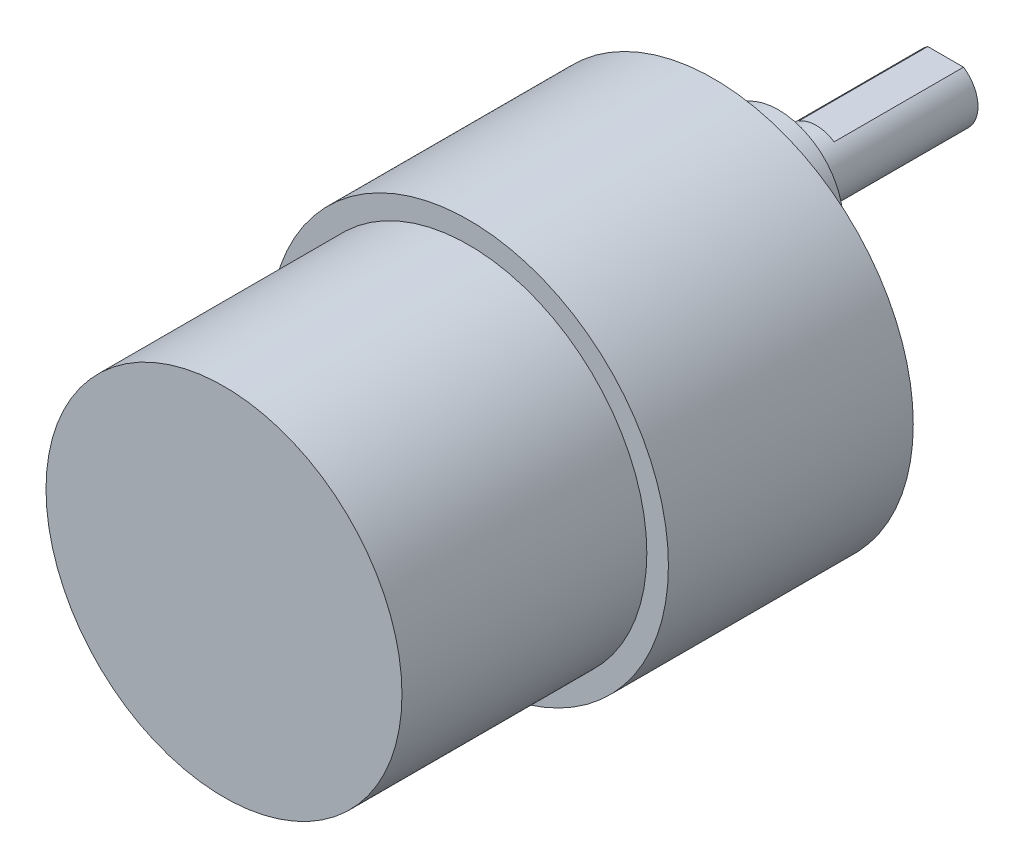
ISO-10303-21;
HEADER;
FILE_DESCRIPTION(('STEP AP214'),'2;1');
FILE_NAME('part.step','',(''),(''),'','','');
FILE_SCHEMA(('AUTOMOTIVE_DESIGN { 1 0 10303 214 1 1 1 1 }'));
ENDSEC;
DATA;
#1=APPLICATION_CONTEXT('core data for automotive mechanical design processes');
#2=APPLICATION_PROTOCOL_DEFINITION('international standard','automotive_design',2000,#1);
#3=PRODUCT_CONTEXT('',#1,'mechanical');
#4=PRODUCT('Part','Part','',(#3));
#5=PRODUCT_RELATED_PRODUCT_CATEGORY('part','',(#4));
#6=PRODUCT_DEFINITION_FORMATION('','',#4);
#7=PRODUCT_DEFINITION_CONTEXT('part definition',#1,'design');
#8=PRODUCT_DEFINITION('design','',#6,#7);
#9=PRODUCT_DEFINITION_SHAPE('','',#8);
#10=(LENGTH_UNIT() NAMED_UNIT(*) SI_UNIT(.MILLI.,.METRE.));
#11=(NAMED_UNIT(*) PLANE_ANGLE_UNIT() SI_UNIT($,.RADIAN.));
#12=(NAMED_UNIT(*) SI_UNIT($,.STERADIAN.) SOLID_ANGLE_UNIT());
#13=UNCERTAINTY_MEASURE_WITH_UNIT(LENGTH_MEASURE(1.E-05),#10,'distance_accuracy_value','');
#14=(GEOMETRIC_REPRESENTATION_CONTEXT(3) GLOBAL_UNCERTAINTY_ASSIGNED_CONTEXT((#13)) GLOBAL_UNIT_ASSIGNED_CONTEXT((#10,
#11,#12)) REPRESENTATION_CONTEXT('',''));
#15=CARTESIAN_POINT('',(0.,0.,0.));
#16=DIRECTION('',(0.,0.,1.));
#17=DIRECTION('',(1.,0.,0.));
#18=AXIS2_PLACEMENT_3D('',#15,#16,#17);
#19=CARTESIAN_POINT('',(0.,0.,22.7));
#20=DIRECTION('',(0.,0.,-1.));
#21=DIRECTION('',(-1.,0.,0.));
#22=AXIS2_PLACEMENT_3D('',#19,#20,#21);
#23=CYLINDRICAL_SURFACE('',#22,18.5);
#24=CARTESIAN_POINT('',(0.,0.,22.7));
#25=DIRECTION('',(0.,0.,1.));
#26=DIRECTION('',(1.,0.,0.));
#27=AXIS2_PLACEMENT_3D('',#24,#25,#26);
#28=CIRCLE('',#27,18.5);
#29=CARTESIAN_POINT('',(18.5,0.,22.7));
#30=VERTEX_POINT('',#29);
#31=EDGE_CURVE('E93',#30,#30,#28,.T.);
#32=ORIENTED_EDGE('',*,*,#31,.F.);
#33=EDGE_LOOP('',(#32));
#34=FACE_BOUND('',#33,.T.);
#35=CARTESIAN_POINT('',(0.,0.,0.));
#36=DIRECTION('',(0.,0.,1.));
#37=DIRECTION('',(1.,0.,0.));
#38=AXIS2_PLACEMENT_3D('',#35,#36,#37);
#39=CIRCLE('',#38,18.5);
#40=CARTESIAN_POINT('',(18.5,0.,0.));
#41=VERTEX_POINT('',#40);
#42=EDGE_CURVE('E89',#41,#41,#39,.T.);
#43=ORIENTED_EDGE('',*,*,#42,.T.);
#44=EDGE_LOOP('',(#43));
#45=FACE_BOUND('',#44,.T.);
#46=ADVANCED_FACE('F40',(#34,#45),#23,.T.);
#47=CARTESIAN_POINT('',(0.,0.,22.7));
#48=DIRECTION('',(0.,0.,1.));
#49=DIRECTION('',(1.,0.,0.));
#50=AXIS2_PLACEMENT_3D('',#47,#48,#49);
#51=PLANE('',#50);
#52=CARTESIAN_POINT('',(0.,0.,22.7));
#53=DIRECTION('',(0.,0.,1.));
#54=DIRECTION('',(1.,0.,0.));
#55=AXIS2_PLACEMENT_3D('',#52,#53,#54);
#56=CIRCLE('',#55,16.5);
#57=CARTESIAN_POINT('',(16.5,0.,22.7));
#58=VERTEX_POINT('',#57);
#59=EDGE_CURVE('E90',#58,#58,#56,.T.);
#60=ORIENTED_EDGE('',*,*,#59,.F.);
#61=EDGE_LOOP('',(#60));
#62=FACE_BOUND('',#61,.T.);
#63=ORIENTED_EDGE('',*,*,#31,.T.);
#64=EDGE_LOOP('',(#63));
#65=FACE_BOUND('',#64,.T.);
#66=ADVANCED_FACE('F107',(#62,#65),#51,.T.);
#67=CARTESIAN_POINT('',(0.,0.,0.));
#68=DIRECTION('',(0.,0.,1.));
#69=DIRECTION('',(1.,0.,0.));
#70=AXIS2_PLACEMENT_3D('',#67,#68,#69);
#71=PLANE('',#70);
#72=CARTESIAN_POINT('',(0.,15.5,0.));
#73=DIRECTION('',(0.,0.,-1.));
#74=DIRECTION('',(-1.,0.,0.));
#75=AXIS2_PLACEMENT_3D('',#72,#73,#74);
#76=CIRCLE('',#75,1.6);
#77=CARTESIAN_POINT('',(-1.6,15.5,0.));
#78=VERTEX_POINT('',#77);
#79=EDGE_CURVE('E200',#78,#78,#76,.T.);
#80=ORIENTED_EDGE('',*,*,#79,.F.);
#81=EDGE_LOOP('',(#80));
#82=FACE_BOUND('',#81,.T.);
#83=CARTESIAN_POINT('',(13.4233937586586,7.74999999999961,0.));
#84=DIRECTION('',(0.,0.,-1.));
#85=DIRECTION('',(-1.,0.,0.));
#86=AXIS2_PLACEMENT_3D('',#83,#84,#85);
#87=CIRCLE('',#86,1.60000000000051);
#88=CARTESIAN_POINT('',(11.8233937586581,7.74999999999961,0.));
#89=VERTEX_POINT('',#88);
#90=EDGE_CURVE('E211',#89,#89,#87,.T.);
#91=ORIENTED_EDGE('',*,*,#90,.F.);
#92=EDGE_LOOP('',(#91));
#93=FACE_BOUND('',#92,.T.);
#94=CARTESIAN_POINT('',(13.4233937586581,-7.75000000000039,0.));
#95=DIRECTION('',(0.,0.,-1.));
#96=DIRECTION('',(-1.,0.,0.));
#97=AXIS2_PLACEMENT_3D('',#94,#95,#96);
#98=CIRCLE('',#97,1.60000000000088);
#99=CARTESIAN_POINT('',(11.8233937586573,-7.75000000000039,0.));
#100=VERTEX_POINT('',#99);
#101=EDGE_CURVE('E210',#100,#100,#98,.T.);
#102=ORIENTED_EDGE('',*,*,#101,.F.);
#103=EDGE_LOOP('',(#102));
#104=FACE_BOUND('',#103,.T.);
#105=CARTESIAN_POINT('',(-8.77276587265167E-13,-15.5,0.));
#106=DIRECTION('',(0.,0.,-1.));
#107=DIRECTION('',(-1.,0.,0.));
#108=AXIS2_PLACEMENT_3D('',#105,#106,#107);
#109=CIRCLE('',#108,1.60000000000094);
#110=CARTESIAN_POINT('',(-1.60000000000182,-15.5,0.));
#111=VERTEX_POINT('',#110);
#112=EDGE_CURVE('E228',#111,#111,#109,.T.);
#113=ORIENTED_EDGE('',*,*,#112,.F.);
#114=EDGE_LOOP('',(#113));
#115=FACE_BOUND('',#114,.T.);
#116=CARTESIAN_POINT('',(-13.4233937586595,-7.74999999999962,0.));
#117=DIRECTION('',(0.,0.,-1.));
#118=DIRECTION('',(-1.,0.,0.));
#119=AXIS2_PLACEMENT_3D('',#116,#117,#118);
#120=CIRCLE('',#119,1.60000000000059);
#121=CARTESIAN_POINT('',(-15.02339375866,-7.74999999999962,0.));
#122=VERTEX_POINT('',#121);
#123=EDGE_CURVE('E222',#122,#122,#120,.T.);
#124=ORIENTED_EDGE('',*,*,#123,.F.);
#125=EDGE_LOOP('',(#124));
#126=FACE_BOUND('',#125,.T.);
#127=CARTESIAN_POINT('',(-13.423393758659,7.75000000000038,0.));
#128=DIRECTION('',(0.,0.,-1.));
#129=DIRECTION('',(-1.,0.,0.));
#130=AXIS2_PLACEMENT_3D('',#127,#128,#129);
#131=CIRCLE('',#130,1.60000000000014);
#132=CARTESIAN_POINT('',(-15.0233937586592,7.75000000000038,0.));
#133=VERTEX_POINT('',#132);
#134=EDGE_CURVE('E216',#133,#133,#131,.T.);
#135=ORIENTED_EDGE('',*,*,#134,.F.);
#136=EDGE_LOOP('',(#135));
#137=FACE_BOUND('',#136,.T.);
#138=CARTESIAN_POINT('',(0.,7.,0.));
#139=DIRECTION('',(0.,0.,1.));
#140=DIRECTION('',(1.,0.,0.));
#141=AXIS2_PLACEMENT_3D('',#138,#139,#140);
#142=CIRCLE('',#141,6.);
#143=CARTESIAN_POINT('',(6.,7.,0.));
#144=VERTEX_POINT('',#143);
#145=EDGE_CURVE('E85',#144,#144,#142,.F.);
#146=ORIENTED_EDGE('',*,*,#145,.F.);
#147=EDGE_LOOP('',(#146));
#148=FACE_BOUND('',#147,.T.);
#149=ORIENTED_EDGE('',*,*,#42,.F.);
#150=EDGE_LOOP('',(#149));
#151=FACE_BOUND('',#150,.T.);
#152=ADVANCED_FACE('F103',(#82,#93,#104,#115,#126,#137,#148,#151),#71,.F.);
#153=CARTESIAN_POINT('',(0.,0.,45.4));
#154=DIRECTION('',(0.,0.,-1.));
#155=DIRECTION('',(-1.,0.,0.));
#156=AXIS2_PLACEMENT_3D('',#153,#154,#155);
#157=CYLINDRICAL_SURFACE('',#156,16.5);
#158=CARTESIAN_POINT('',(0.,0.,45.4));
#159=DIRECTION('',(0.,0.,1.));
#160=DIRECTION('',(1.,0.,0.));
#161=AXIS2_PLACEMENT_3D('',#158,#159,#160);
#162=CIRCLE('',#161,16.5);
#163=CARTESIAN_POINT('',(16.5,0.,45.4));
#164=VERTEX_POINT('',#163);
#165=EDGE_CURVE('E80',#164,#164,#162,.T.);
#166=ORIENTED_EDGE('',*,*,#165,.F.);
#167=EDGE_LOOP('',(#166));
#168=FACE_BOUND('',#167,.T.);
#169=ORIENTED_EDGE('',*,*,#59,.T.);
#170=EDGE_LOOP('',(#169));
#171=FACE_BOUND('',#170,.T.);
#172=ADVANCED_FACE('F106',(#168,#171),#157,.T.);
#173=CARTESIAN_POINT('',(0.,0.,45.4));
#174=DIRECTION('',(0.,0.,1.));
#175=DIRECTION('',(1.,0.,0.));
#176=AXIS2_PLACEMENT_3D('',#173,#174,#175);
#177=PLANE('',#176);
#178=ORIENTED_EDGE('',*,*,#165,.T.);
#179=EDGE_LOOP('',(#178));
#180=FACE_BOUND('',#179,.T.);
#181=ADVANCED_FACE('F126',(#180),#177,.T.);
#182=CARTESIAN_POINT('',(0.,7.,-6.));
#183=DIRECTION('',(0.,0.,1.));
#184=DIRECTION('',(1.,0.,0.));
#185=AXIS2_PLACEMENT_3D('',#182,#183,#184);
#186=CYLINDRICAL_SURFACE('',#185,6.);
#187=CARTESIAN_POINT('',(0.,7.,-6.));
#188=DIRECTION('',(0.,0.,-1.));
#189=DIRECTION('',(-1.,0.,0.));
#190=AXIS2_PLACEMENT_3D('',#187,#188,#189);
#191=CIRCLE('',#190,6.);
#192=CARTESIAN_POINT('',(-6.,7.,-6.));
#193=VERTEX_POINT('',#192);
#194=EDGE_CURVE('E77',#193,#193,#191,.T.);
#195=ORIENTED_EDGE('',*,*,#194,.F.);
#196=EDGE_LOOP('',(#195));
#197=FACE_BOUND('',#196,.T.);
#198=ORIENTED_EDGE('',*,*,#145,.T.);
#199=EDGE_LOOP('',(#198));
#200=FACE_BOUND('',#199,.T.);
#201=ADVANCED_FACE('F101',(#197,#200),#186,.T.);
#202=CARTESIAN_POINT('',(0.,7.,-6.));
#203=DIRECTION('',(0.,0.,-1.));
#204=DIRECTION('',(-1.,0.,0.));
#205=AXIS2_PLACEMENT_3D('',#202,#203,#204);
#206=PLANE('',#205);
#207=CARTESIAN_POINT('',(0.,7.,-6.));
#208=DIRECTION('',(0.,0.,-1.));
#209=DIRECTION('',(-1.,0.,0.));
#210=AXIS2_PLACEMENT_3D('',#207,#208,#209);
#211=CIRCLE('',#210,3.);
#212=CARTESIAN_POINT('',(-3.,7.,-6.));
#213=VERTEX_POINT('',#212);
#214=EDGE_CURVE('E68',#213,#213,#211,.T.);
#215=ORIENTED_EDGE('',*,*,#214,.F.);
#216=EDGE_LOOP('',(#215));
#217=FACE_BOUND('',#216,.T.);
#218=ORIENTED_EDGE('',*,*,#194,.T.);
#219=EDGE_LOOP('',(#218));
#220=FACE_BOUND('',#219,.T.);
#221=ADVANCED_FACE('F133',(#217,#220),#206,.T.);
#222=CARTESIAN_POINT('',(0.,7.,-21.5));
#223=DIRECTION('',(0.,0.,1.));
#224=DIRECTION('',(1.,0.,0.));
#225=AXIS2_PLACEMENT_3D('',#222,#223,#224);
#226=CYLINDRICAL_SURFACE('',#225,3.);
#227=CARTESIAN_POINT('',(0.,7.,-21.5));
#228=DIRECTION('',(0.,0.,-1.));
#229=DIRECTION('',(-1.,0.,0.));
#230=AXIS2_PLACEMENT_3D('',#227,#228,#229);
#231=CIRCLE('',#230,3.);
#232=CARTESIAN_POINT('',(1.6583123951777,9.5,-21.5));
#233=VERTEX_POINT('',#232);
#234=CARTESIAN_POINT('',(-1.6583123951777,9.5,-21.5));
#235=VERTEX_POINT('',#234);
#236=EDGE_CURVE('E73',#233,#235,#231,.T.);
#237=ORIENTED_EDGE('',*,*,#236,.F.);
#238=DIRECTION('',(0.,0.,1.));
#239=VECTOR('',#238,1.);
#240=CARTESIAN_POINT('',(1.6583123951777,9.5,-21.5));
#241=LINE('',#240,#239);
#242=CARTESIAN_POINT('',(1.6583123951777,9.5,-9.5));
#243=VERTEX_POINT('',#242);
#244=EDGE_CURVE('E54',#233,#243,#241,.T.);
#245=ORIENTED_EDGE('',*,*,#244,.T.);
#246=CARTESIAN_POINT('',(0.,7.,-9.5));
#247=DIRECTION('',(0.,0.,-1.));
#248=DIRECTION('',(-1.,0.,0.));
#249=AXIS2_PLACEMENT_3D('',#246,#247,#248);
#250=CIRCLE('',#249,3.);
#251=CARTESIAN_POINT('',(-1.6583123951777,9.5,-9.5));
#252=VERTEX_POINT('',#251);
#253=EDGE_CURVE('E11',#252,#243,#250,.T.);
#254=ORIENTED_EDGE('',*,*,#253,.F.);
#255=DIRECTION('',(0.,0.,1.));
#256=VECTOR('',#255,1.);
#257=CARTESIAN_POINT('',(-1.6583123951777,9.5,-21.5));
#258=LINE('',#257,#256);
#259=EDGE_CURVE('E59',#252,#235,#258,.F.);
#260=ORIENTED_EDGE('',*,*,#259,.T.);
#261=EDGE_LOOP('',(#237,#245,#254,#260));
#262=FACE_BOUND('',#261,.T.);
#263=ORIENTED_EDGE('',*,*,#214,.T.);
#264=EDGE_LOOP('',(#263));
#265=FACE_BOUND('',#264,.T.);
#266=ADVANCED_FACE('F71',(#262,#265),#226,.T.);
#267=CARTESIAN_POINT('',(0.,7.,-21.5));
#268=DIRECTION('',(0.,0.,-1.));
#269=DIRECTION('',(-1.,0.,0.));
#270=AXIS2_PLACEMENT_3D('',#267,#268,#269);
#271=PLANE('',#270);
#272=DIRECTION('',(-1.,0.,0.));
#273=VECTOR('',#272,1.);
#274=CARTESIAN_POINT('',(0.,9.5,-21.5));
#275=LINE('',#274,#273);
#276=EDGE_CURVE('E47',#233,#235,#275,.T.);
#277=ORIENTED_EDGE('',*,*,#276,.F.);
#278=ORIENTED_EDGE('',*,*,#236,.T.);
#279=EDGE_LOOP('',(#277,#278));
#280=FACE_BOUND('',#279,.T.);
#281=ADVANCED_FACE('F76',(#280),#271,.T.);
#282=CARTESIAN_POINT('',(0.,0.,-9.5));
#283=DIRECTION('',(0.,0.,-1.));
#284=DIRECTION('',(-1.,0.,0.));
#285=AXIS2_PLACEMENT_3D('',#282,#283,#284);
#286=PLANE('',#285);
#287=ORIENTED_EDGE('',*,*,#253,.T.);
#288=DIRECTION('',(-1.,0.,0.));
#289=VECTOR('',#288,1.);
#290=CARTESIAN_POINT('',(6.23706785214188,9.5,-9.5));
#291=LINE('',#290,#289);
#292=EDGE_CURVE('E74',#243,#252,#291,.T.);
#293=ORIENTED_EDGE('',*,*,#292,.T.);
#294=EDGE_LOOP('',(#287,#293));
#295=FACE_BOUND('',#294,.T.);
#296=ADVANCED_FACE('F142',(#295),#286,.T.);
#297=CARTESIAN_POINT('',(6.23706785214188,9.5,-9.5));
#298=DIRECTION('',(0.,-1.,0.));
#299=DIRECTION('',(0.,0.,-1.));
#300=AXIS2_PLACEMENT_3D('',#297,#298,#299);
#301=PLANE('',#300);
#302=ORIENTED_EDGE('',*,*,#276,.T.);
#303=ORIENTED_EDGE('',*,*,#259,.F.);
#304=ORIENTED_EDGE('',*,*,#292,.F.);
#305=ORIENTED_EDGE('',*,*,#244,.F.);
#306=EDGE_LOOP('',(#302,#303,#304,#305));
#307=FACE_BOUND('',#306,.T.);
#308=ADVANCED_FACE('F64',(#307),#301,.F.);
#309=CARTESIAN_POINT('',(-13.423393758659,7.75000000000038,10.));
#310=DIRECTION('',(0.,0.,-1.));
#311=DIRECTION('',(-1.,0.,0.));
#312=AXIS2_PLACEMENT_3D('',#309,#310,#311);
#313=CYLINDRICAL_SURFACE('',#312,1.60000000000014);
#314=CARTESIAN_POINT('',(-13.423393758659,7.75000000000038,10.));
#315=DIRECTION('',(0.,0.,-1.));
#316=DIRECTION('',(-1.,0.,0.));
#317=AXIS2_PLACEMENT_3D('',#314,#315,#316);
#318=CIRCLE('',#317,1.60000000000014);
#319=CARTESIAN_POINT('',(-15.0233937586592,7.75000000000038,10.));
#320=VERTEX_POINT('',#319);
#321=EDGE_CURVE('E204',#320,#320,#318,.T.);
#322=ORIENTED_EDGE('',*,*,#321,.F.);
#323=EDGE_LOOP('',(#322));
#324=FACE_BOUND('',#323,.T.);
#325=ORIENTED_EDGE('',*,*,#134,.T.);
#326=EDGE_LOOP('',(#325));
#327=FACE_BOUND('',#326,.T.);
#328=ADVANCED_FACE('F145',(#324,#327),#313,.F.);
#329=CARTESIAN_POINT('',(-13.423393758659,7.75000000000038,10.));
#330=DIRECTION('',(0.,0.,-1.));
#331=DIRECTION('',(-1.,0.,0.));
#332=AXIS2_PLACEMENT_3D('',#329,#330,#331);
#333=PLANE('',#332);
#334=ORIENTED_EDGE('',*,*,#321,.T.);
#335=EDGE_LOOP('',(#334));
#336=FACE_BOUND('',#335,.T.);
#337=ADVANCED_FACE('F170',(#336),#333,.T.);
#338=CARTESIAN_POINT('',(-13.4233937586595,-7.74999999999962,10.));
#339=DIRECTION('',(0.,0.,-1.));
#340=DIRECTION('',(-1.,0.,0.));
#341=AXIS2_PLACEMENT_3D('',#338,#339,#340);
#342=CYLINDRICAL_SURFACE('',#341,1.60000000000059);
#343=CARTESIAN_POINT('',(-13.4233937586595,-7.74999999999962,10.));
#344=DIRECTION('',(0.,0.,-1.));
#345=DIRECTION('',(-1.,0.,0.));
#346=AXIS2_PLACEMENT_3D('',#343,#344,#345);
#347=CIRCLE('',#346,1.60000000000059);
#348=CARTESIAN_POINT('',(-15.02339375866,-7.74999999999962,10.));
#349=VERTEX_POINT('',#348);
#350=EDGE_CURVE('E219',#349,#349,#347,.T.);
#351=ORIENTED_EDGE('',*,*,#350,.F.);
#352=EDGE_LOOP('',(#351));
#353=FACE_BOUND('',#352,.T.);
#354=ORIENTED_EDGE('',*,*,#123,.T.);
#355=EDGE_LOOP('',(#354));
#356=FACE_BOUND('',#355,.T.);
#357=ADVANCED_FACE('F167',(#353,#356),#342,.F.);
#358=CARTESIAN_POINT('',(-13.4233937586595,-7.74999999999962,10.));
#359=DIRECTION('',(0.,0.,-1.));
#360=DIRECTION('',(-1.,0.,0.));
#361=AXIS2_PLACEMENT_3D('',#358,#359,#360);
#362=PLANE('',#361);
#363=ORIENTED_EDGE('',*,*,#350,.T.);
#364=EDGE_LOOP('',(#363));
#365=FACE_BOUND('',#364,.T.);
#366=ADVANCED_FACE('F162',(#365),#362,.T.);
#367=CARTESIAN_POINT('',(-8.77276587265167E-13,-15.5,10.));
#368=DIRECTION('',(0.,0.,-1.));
#369=DIRECTION('',(-1.,0.,0.));
#370=AXIS2_PLACEMENT_3D('',#367,#368,#369);
#371=CYLINDRICAL_SURFACE('',#370,1.60000000000094);
#372=CARTESIAN_POINT('',(-8.77276587265167E-13,-15.5,10.));
#373=DIRECTION('',(0.,0.,-1.));
#374=DIRECTION('',(-1.,0.,0.));
#375=AXIS2_PLACEMENT_3D('',#372,#373,#374);
#376=CIRCLE('',#375,1.60000000000094);
#377=CARTESIAN_POINT('',(-1.60000000000182,-15.5,10.));
#378=VERTEX_POINT('',#377);
#379=EDGE_CURVE('E225',#378,#378,#376,.T.);
#380=ORIENTED_EDGE('',*,*,#379,.F.);
#381=EDGE_LOOP('',(#380));
#382=FACE_BOUND('',#381,.T.);
#383=ORIENTED_EDGE('',*,*,#112,.T.);
#384=EDGE_LOOP('',(#383));
#385=FACE_BOUND('',#384,.T.);
#386=ADVANCED_FACE('F159',(#382,#385),#371,.F.);
#387=CARTESIAN_POINT('',(-8.77276587265167E-13,-15.5,10.));
#388=DIRECTION('',(0.,0.,-1.));
#389=DIRECTION('',(-1.,0.,0.));
#390=AXIS2_PLACEMENT_3D('',#387,#388,#389);
#391=PLANE('',#390);
#392=ORIENTED_EDGE('',*,*,#379,.T.);
#393=EDGE_LOOP('',(#392));
#394=FACE_BOUND('',#393,.T.);
#395=ADVANCED_FACE('F153',(#394),#391,.T.);
#396=CARTESIAN_POINT('',(13.4233937586581,-7.75000000000039,10.));
#397=DIRECTION('',(0.,0.,-1.));
#398=DIRECTION('',(-1.,0.,0.));
#399=AXIS2_PLACEMENT_3D('',#396,#397,#398);
#400=CYLINDRICAL_SURFACE('',#399,1.60000000000088);
#401=CARTESIAN_POINT('',(13.4233937586581,-7.75000000000039,10.));
#402=DIRECTION('',(0.,0.,-1.));
#403=DIRECTION('',(-1.,0.,0.));
#404=AXIS2_PLACEMENT_3D('',#401,#402,#403);
#405=CIRCLE('',#404,1.60000000000088);
#406=CARTESIAN_POINT('',(11.8233937586573,-7.75000000000039,10.));
#407=VERTEX_POINT('',#406);
#408=EDGE_CURVE('E231',#407,#407,#405,.T.);
#409=ORIENTED_EDGE('',*,*,#408,.F.);
#410=EDGE_LOOP('',(#409));
#411=FACE_BOUND('',#410,.T.);
#412=ORIENTED_EDGE('',*,*,#101,.T.);
#413=EDGE_LOOP('',(#412));
#414=FACE_BOUND('',#413,.T.);
#415=ADVANCED_FACE('F149',(#411,#414),#400,.F.);
#416=CARTESIAN_POINT('',(13.4233937586581,-7.75000000000039,10.));
#417=DIRECTION('',(0.,0.,-1.));
#418=DIRECTION('',(-1.,0.,0.));
#419=AXIS2_PLACEMENT_3D('',#416,#417,#418);
#420=PLANE('',#419);
#421=ORIENTED_EDGE('',*,*,#408,.T.);
#422=EDGE_LOOP('',(#421));
#423=FACE_BOUND('',#422,.T.);
#424=ADVANCED_FACE('F152',(#423),#420,.T.);
#425=CARTESIAN_POINT('',(13.4233937586586,7.74999999999961,10.));
#426=DIRECTION('',(0.,0.,-1.));
#427=DIRECTION('',(-1.,0.,0.));
#428=AXIS2_PLACEMENT_3D('',#425,#426,#427);
#429=CYLINDRICAL_SURFACE('',#428,1.60000000000051);
#430=CARTESIAN_POINT('',(13.4233937586586,7.74999999999961,10.));
#431=DIRECTION('',(0.,0.,-1.));
#432=DIRECTION('',(-1.,0.,0.));
#433=AXIS2_PLACEMENT_3D('',#430,#431,#432);
#434=CIRCLE('',#433,1.60000000000051);
#435=CARTESIAN_POINT('',(11.8233937586581,7.74999999999961,10.));
#436=VERTEX_POINT('',#435);
#437=EDGE_CURVE('E207',#436,#436,#434,.T.);
#438=ORIENTED_EDGE('',*,*,#437,.F.);
#439=EDGE_LOOP('',(#438));
#440=FACE_BOUND('',#439,.T.);
#441=ORIENTED_EDGE('',*,*,#90,.T.);
#442=EDGE_LOOP('',(#441));
#443=FACE_BOUND('',#442,.T.);
#444=ADVANCED_FACE('F157',(#440,#443),#429,.F.);
#445=CARTESIAN_POINT('',(13.4233937586586,7.74999999999961,10.));
#446=DIRECTION('',(0.,0.,-1.));
#447=DIRECTION('',(-1.,0.,0.));
#448=AXIS2_PLACEMENT_3D('',#445,#446,#447);
#449=PLANE('',#448);
#450=ORIENTED_EDGE('',*,*,#437,.T.);
#451=EDGE_LOOP('',(#450));
#452=FACE_BOUND('',#451,.T.);
#453=ADVANCED_FACE('F183',(#452),#449,.T.);
#454=CARTESIAN_POINT('',(0.,15.5,10.));
#455=DIRECTION('',(0.,0.,-1.));
#456=DIRECTION('',(-1.,0.,0.));
#457=AXIS2_PLACEMENT_3D('',#454,#455,#456);
#458=CYLINDRICAL_SURFACE('',#457,1.6);
#459=CARTESIAN_POINT('',(0.,15.5,10.));
#460=DIRECTION('',(0.,0.,-1.));
#461=DIRECTION('',(-1.,0.,0.));
#462=AXIS2_PLACEMENT_3D('',#459,#460,#461);
#463=CIRCLE('',#462,1.6);
#464=CARTESIAN_POINT('',(-1.6,15.5,10.));
#465=VERTEX_POINT('',#464);
#466=EDGE_CURVE('E199',#465,#465,#463,.T.);
#467=ORIENTED_EDGE('',*,*,#466,.F.);
#468=EDGE_LOOP('',(#467));
#469=FACE_BOUND('',#468,.T.);
#470=ORIENTED_EDGE('',*,*,#79,.T.);
#471=EDGE_LOOP('',(#470));
#472=FACE_BOUND('',#471,.T.);
#473=ADVANCED_FACE('F187',(#469,#472),#458,.F.);
#474=CARTESIAN_POINT('',(0.,15.5,10.));
#475=DIRECTION('',(0.,0.,-1.));
#476=DIRECTION('',(-1.,0.,0.));
#477=AXIS2_PLACEMENT_3D('',#474,#475,#476);
#478=PLANE('',#477);
#479=ORIENTED_EDGE('',*,*,#466,.T.);
#480=EDGE_LOOP('',(#479));
#481=FACE_BOUND('',#480,.T.);
#482=ADVANCED_FACE('F191',(#481),#478,.T.);
#483=CLOSED_SHELL('',(#46,#66,#152,#172,#181,#201,#221,#266,#281,#296,#308,#328,#337,#357,#366,
#386,#395,#415,#424,#444,#453,#473,#482));
#484=MANIFOLD_SOLID_BREP('B2',#483);
#485=ADVANCED_BREP_SHAPE_REPRESENTATION('',(#18,#484),#14);
#486=SHAPE_DEFINITION_REPRESENTATION(#9,#485);
ENDSEC;
END-ISO-10303-21;
